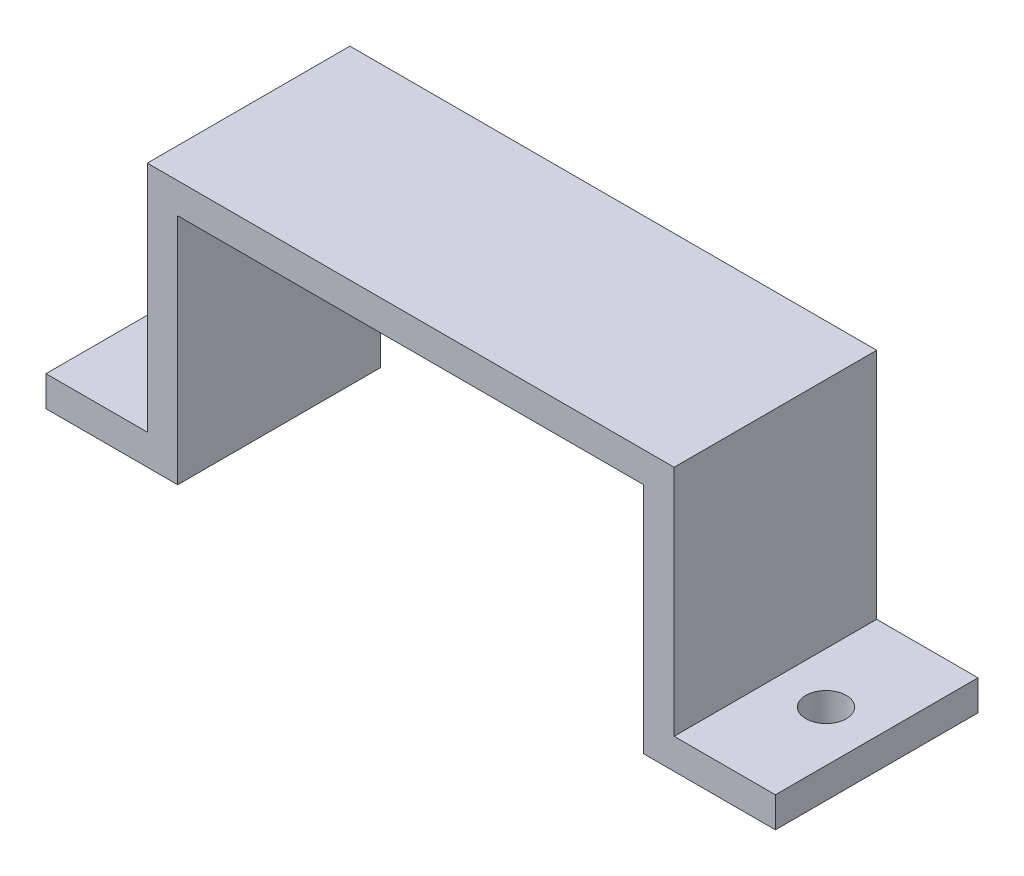
ISO-10303-21;
HEADER;
FILE_DESCRIPTION(('STEP AP214'),'2;1');
FILE_NAME('part.step','',(''),(''),'','','');
FILE_SCHEMA(('AUTOMOTIVE_DESIGN { 1 0 10303 214 1 1 1 1 }'));
ENDSEC;
DATA;
#1=APPLICATION_CONTEXT('core data for automotive mechanical design processes');
#2=APPLICATION_PROTOCOL_DEFINITION('international standard','automotive_design',2000,#1);
#3=PRODUCT_CONTEXT('',#1,'mechanical');
#4=PRODUCT('Part','Part','',(#3));
#5=PRODUCT_RELATED_PRODUCT_CATEGORY('part','',(#4));
#6=PRODUCT_DEFINITION_FORMATION('','',#4);
#7=PRODUCT_DEFINITION_CONTEXT('part definition',#1,'design');
#8=PRODUCT_DEFINITION('design','',#6,#7);
#9=PRODUCT_DEFINITION_SHAPE('','',#8);
#10=(LENGTH_UNIT() NAMED_UNIT(*) SI_UNIT(.MILLI.,.METRE.));
#11=(NAMED_UNIT(*) PLANE_ANGLE_UNIT() SI_UNIT($,.RADIAN.));
#12=(NAMED_UNIT(*) SI_UNIT($,.STERADIAN.) SOLID_ANGLE_UNIT());
#13=UNCERTAINTY_MEASURE_WITH_UNIT(LENGTH_MEASURE(1.E-05),#10,'distance_accuracy_value','');
#14=(GEOMETRIC_REPRESENTATION_CONTEXT(3) GLOBAL_UNCERTAINTY_ASSIGNED_CONTEXT((#13)) GLOBAL_UNIT_ASSIGNED_CONTEXT((#10,
#11,#12)) REPRESENTATION_CONTEXT('',''));
#15=CARTESIAN_POINT('',(0.,0.,0.));
#16=DIRECTION('',(0.,0.,1.));
#17=DIRECTION('',(1.,0.,0.));
#18=AXIS2_PLACEMENT_3D('',#15,#16,#17);
#19=CARTESIAN_POINT('',(-11.5,0.,10.));
#20=DIRECTION('',(-1.,0.,0.));
#21=DIRECTION('',(0.,-1.,0.));
#22=AXIS2_PLACEMENT_3D('',#19,#20,#21);
#23=PLANE('',#22);
#24=DIRECTION('',(0.,1.,0.));
#25=VECTOR('',#24,1.);
#26=CARTESIAN_POINT('',(-11.5,0.,0.));
#27=LINE('',#26,#25);
#28=CARTESIAN_POINT('',(-11.5,-1.5,0.));
#29=VERTEX_POINT('',#28);
#30=CARTESIAN_POINT('',(-11.5,10.,0.));
#31=VERTEX_POINT('',#30);
#32=EDGE_CURVE('E98',#29,#31,#27,.T.);
#33=ORIENTED_EDGE('',*,*,#32,.T.);
#34=DIRECTION('',(0.,0.,-1.));
#35=VECTOR('',#34,1.);
#36=CARTESIAN_POINT('',(-11.5,10.,10.));
#37=LINE('',#36,#35);
#38=CARTESIAN_POINT('',(-11.5,10.,10.));
#39=VERTEX_POINT('',#38);
#40=EDGE_CURVE('E11',#39,#31,#37,.T.);
#41=ORIENTED_EDGE('',*,*,#40,.F.);
#42=DIRECTION('',(0.,1.,0.));
#43=VECTOR('',#42,1.);
#44=CARTESIAN_POINT('',(-11.5,-1.5,10.));
#45=LINE('',#44,#43);
#46=CARTESIAN_POINT('',(-11.5,-1.5,10.));
#47=VERTEX_POINT('',#46);
#48=EDGE_CURVE('E104',#47,#39,#45,.T.);
#49=ORIENTED_EDGE('',*,*,#48,.F.);
#50=DIRECTION('',(0.,0.,-1.));
#51=VECTOR('',#50,1.);
#52=CARTESIAN_POINT('',(-11.5,-1.5,10.));
#53=LINE('',#52,#51);
#54=EDGE_CURVE('E150',#47,#29,#53,.T.);
#55=ORIENTED_EDGE('',*,*,#54,.T.);
#56=EDGE_LOOP('',(#33,#41,#49,#55));
#57=FACE_BOUND('',#56,.T.);
#58=ADVANCED_FACE('F33',(#57),#23,.F.);
#59=CARTESIAN_POINT('',(-11.5,10.,10.));
#60=DIRECTION('',(0.,1.,0.));
#61=DIRECTION('',(-1.,0.,0.));
#62=AXIS2_PLACEMENT_3D('',#59,#60,#61);
#63=PLANE('',#62);
#64=DIRECTION('',(1.,0.,0.));
#65=VECTOR('',#64,1.);
#66=CARTESIAN_POINT('',(-11.5,10.,0.));
#67=LINE('',#66,#65);
#68=CARTESIAN_POINT('',(11.5,10.,0.));
#69=VERTEX_POINT('',#68);
#70=EDGE_CURVE('E155',#31,#69,#67,.T.);
#71=ORIENTED_EDGE('',*,*,#70,.T.);
#72=DIRECTION('',(0.,0.,-1.));
#73=VECTOR('',#72,1.);
#74=CARTESIAN_POINT('',(11.5,10.,10.));
#75=LINE('',#74,#73);
#76=CARTESIAN_POINT('',(11.5,10.,10.));
#77=VERTEX_POINT('',#76);
#78=EDGE_CURVE('E42',#77,#69,#75,.T.);
#79=ORIENTED_EDGE('',*,*,#78,.F.);
#80=DIRECTION('',(1.,0.,0.));
#81=VECTOR('',#80,1.);
#82=CARTESIAN_POINT('',(-11.5,10.,10.));
#83=LINE('',#82,#81);
#84=EDGE_CURVE('E208',#39,#77,#83,.T.);
#85=ORIENTED_EDGE('',*,*,#84,.F.);
#86=ORIENTED_EDGE('',*,*,#40,.T.);
#87=EDGE_LOOP('',(#71,#79,#85,#86));
#88=FACE_BOUND('',#87,.T.);
#89=ADVANCED_FACE('F207',(#88),#63,.F.);
#90=CARTESIAN_POINT('',(11.5,-1.5,10.));
#91=DIRECTION('',(1.,0.,0.));
#92=DIRECTION('',(0.,1.,0.));
#93=AXIS2_PLACEMENT_3D('',#90,#91,#92);
#94=PLANE('',#93);
#95=DIRECTION('',(0.,-1.,0.));
#96=VECTOR('',#95,1.);
#97=CARTESIAN_POINT('',(11.5,-1.5,0.));
#98=LINE('',#97,#96);
#99=CARTESIAN_POINT('',(11.5,-1.5,0.));
#100=VERTEX_POINT('',#99);
#101=EDGE_CURVE('E158',#69,#100,#98,.T.);
#102=ORIENTED_EDGE('',*,*,#101,.T.);
#103=DIRECTION('',(0.,0.,-1.));
#104=VECTOR('',#103,1.);
#105=CARTESIAN_POINT('',(11.5,-1.5,10.));
#106=LINE('',#105,#104);
#107=CARTESIAN_POINT('',(11.5,-1.5,10.));
#108=VERTEX_POINT('',#107);
#109=EDGE_CURVE('E195',#108,#100,#106,.T.);
#110=ORIENTED_EDGE('',*,*,#109,.F.);
#111=DIRECTION('',(0.,-1.,0.));
#112=VECTOR('',#111,1.);
#113=CARTESIAN_POINT('',(11.5,10.,10.));
#114=LINE('',#113,#112);
#115=EDGE_CURVE('E204',#77,#108,#114,.T.);
#116=ORIENTED_EDGE('',*,*,#115,.F.);
#117=ORIENTED_EDGE('',*,*,#78,.T.);
#118=EDGE_LOOP('',(#102,#110,#116,#117));
#119=FACE_BOUND('',#118,.T.);
#120=ADVANCED_FACE('F202',(#119),#94,.F.);
#121=CARTESIAN_POINT('',(18.,-1.5,10.));
#122=DIRECTION('',(0.,1.,0.));
#123=DIRECTION('',(0.,0.,1.));
#124=AXIS2_PLACEMENT_3D('',#121,#122,#123);
#125=PLANE('',#124);
#126=CARTESIAN_POINT('',(15.5,-1.5,4.99999999999999));
#127=DIRECTION('',(0.,1.,0.));
#128=DIRECTION('',(1.,0.,0.));
#129=AXIS2_PLACEMENT_3D('',#126,#127,#128);
#130=CIRCLE('',#129,1.);
#131=CARTESIAN_POINT('',(16.5,-1.5,4.99999999999999));
#132=VERTEX_POINT('',#131);
#133=EDGE_CURVE('E253',#132,#132,#130,.T.);
#134=ORIENTED_EDGE('',*,*,#133,.T.);
#135=EDGE_LOOP('',(#134));
#136=FACE_BOUND('',#135,.T.);
#137=DIRECTION('',(1.,0.,0.));
#138=VECTOR('',#137,1.);
#139=CARTESIAN_POINT('',(18.,-1.5,0.));
#140=LINE('',#139,#138);
#141=CARTESIAN_POINT('',(18.,-1.5,0.));
#142=VERTEX_POINT('',#141);
#143=EDGE_CURVE('E160',#100,#142,#140,.T.);
#144=ORIENTED_EDGE('',*,*,#143,.T.);
#145=DIRECTION('',(0.,0.,-1.));
#146=VECTOR('',#145,1.);
#147=CARTESIAN_POINT('',(18.,-1.5,10.));
#148=LINE('',#147,#146);
#149=CARTESIAN_POINT('',(18.,-1.5,10.));
#150=VERTEX_POINT('',#149);
#151=EDGE_CURVE('E192',#150,#142,#148,.T.);
#152=ORIENTED_EDGE('',*,*,#151,.F.);
#153=DIRECTION('',(1.,0.,0.));
#154=VECTOR('',#153,1.);
#155=CARTESIAN_POINT('',(18.,-1.5,10.));
#156=LINE('',#155,#154);
#157=EDGE_CURVE('E224',#108,#150,#156,.T.);
#158=ORIENTED_EDGE('',*,*,#157,.F.);
#159=ORIENTED_EDGE('',*,*,#109,.T.);
#160=EDGE_LOOP('',(#144,#152,#158,#159));
#161=FACE_BOUND('',#160,.T.);
#162=ADVANCED_FACE('F215',(#136,#161),#125,.F.);
#163=CARTESIAN_POINT('',(18.,0.,10.));
#164=DIRECTION('',(-1.,0.,0.));
#165=DIRECTION('',(0.,0.,1.));
#166=AXIS2_PLACEMENT_3D('',#163,#164,#165);
#167=PLANE('',#166);
#168=DIRECTION('',(0.,1.,0.));
#169=VECTOR('',#168,1.);
#170=CARTESIAN_POINT('',(18.,0.,0.));
#171=LINE('',#170,#169);
#172=CARTESIAN_POINT('',(18.,0.,0.));
#173=VERTEX_POINT('',#172);
#174=EDGE_CURVE('E162',#142,#173,#171,.T.);
#175=ORIENTED_EDGE('',*,*,#174,.T.);
#176=DIRECTION('',(0.,0.,-1.));
#177=VECTOR('',#176,1.);
#178=CARTESIAN_POINT('',(18.,0.,10.));
#179=LINE('',#178,#177);
#180=CARTESIAN_POINT('',(18.,0.,10.));
#181=VERTEX_POINT('',#180);
#182=EDGE_CURVE('E189',#181,#173,#179,.T.);
#183=ORIENTED_EDGE('',*,*,#182,.F.);
#184=DIRECTION('',(0.,1.,0.));
#185=VECTOR('',#184,1.);
#186=CARTESIAN_POINT('',(18.,0.,10.));
#187=LINE('',#186,#185);
#188=EDGE_CURVE('E221',#150,#181,#187,.T.);
#189=ORIENTED_EDGE('',*,*,#188,.F.);
#190=ORIENTED_EDGE('',*,*,#151,.T.);
#191=EDGE_LOOP('',(#175,#183,#189,#190));
#192=FACE_BOUND('',#191,.T.);
#193=ADVANCED_FACE('F219',(#192),#167,.F.);
#194=CARTESIAN_POINT('',(13.,0.,10.));
#195=DIRECTION('',(0.,-1.,0.));
#196=DIRECTION('',(1.,0.,0.));
#197=AXIS2_PLACEMENT_3D('',#194,#195,#196);
#198=PLANE('',#197);
#199=CARTESIAN_POINT('',(15.5,0.,4.99999999999999));
#200=DIRECTION('',(0.,-1.,0.));
#201=DIRECTION('',(1.,0.,0.));
#202=AXIS2_PLACEMENT_3D('',#199,#200,#201);
#203=CIRCLE('',#202,1.);
#204=CARTESIAN_POINT('',(16.5,0.,4.99999999999999));
#205=VERTEX_POINT('',#204);
#206=EDGE_CURVE('E36',#205,#205,#203,.T.);
#207=ORIENTED_EDGE('',*,*,#206,.T.);
#208=EDGE_LOOP('',(#207));
#209=FACE_BOUND('',#208,.T.);
#210=DIRECTION('',(-1.,0.,0.));
#211=VECTOR('',#210,1.);
#212=CARTESIAN_POINT('',(13.,0.,0.));
#213=LINE('',#212,#211);
#214=CARTESIAN_POINT('',(13.,0.,0.));
#215=VERTEX_POINT('',#214);
#216=EDGE_CURVE('E164',#173,#215,#213,.T.);
#217=ORIENTED_EDGE('',*,*,#216,.T.);
#218=DIRECTION('',(0.,0.,-1.));
#219=VECTOR('',#218,1.);
#220=CARTESIAN_POINT('',(13.,0.,10.));
#221=LINE('',#220,#219);
#222=CARTESIAN_POINT('',(13.,0.,10.));
#223=VERTEX_POINT('',#222);
#224=EDGE_CURVE('E186',#223,#215,#221,.T.);
#225=ORIENTED_EDGE('',*,*,#224,.F.);
#226=DIRECTION('',(-1.,0.,0.));
#227=VECTOR('',#226,1.);
#228=CARTESIAN_POINT('',(13.,0.,10.));
#229=LINE('',#228,#227);
#230=EDGE_CURVE('E223',#181,#223,#229,.T.);
#231=ORIENTED_EDGE('',*,*,#230,.F.);
#232=ORIENTED_EDGE('',*,*,#182,.T.);
#233=EDGE_LOOP('',(#217,#225,#231,#232));
#234=FACE_BOUND('',#233,.T.);
#235=ADVANCED_FACE('F289',(#209,#234),#198,.F.);
#236=CARTESIAN_POINT('',(13.,11.5,10.));
#237=DIRECTION('',(-1.,0.,0.));
#238=DIRECTION('',(0.,-1.,0.));
#239=AXIS2_PLACEMENT_3D('',#236,#237,#238);
#240=PLANE('',#239);
#241=DIRECTION('',(0.,1.,0.));
#242=VECTOR('',#241,1.);
#243=CARTESIAN_POINT('',(13.,11.5,0.));
#244=LINE('',#243,#242);
#245=CARTESIAN_POINT('',(13.,11.5,0.));
#246=VERTEX_POINT('',#245);
#247=EDGE_CURVE('E166',#215,#246,#244,.T.);
#248=ORIENTED_EDGE('',*,*,#247,.T.);
#249=DIRECTION('',(0.,0.,-1.));
#250=VECTOR('',#249,1.);
#251=CARTESIAN_POINT('',(13.,11.5,10.));
#252=LINE('',#251,#250);
#253=CARTESIAN_POINT('',(13.,11.5,10.));
#254=VERTEX_POINT('',#253);
#255=EDGE_CURVE('E183',#254,#246,#252,.T.);
#256=ORIENTED_EDGE('',*,*,#255,.F.);
#257=DIRECTION('',(0.,1.,0.));
#258=VECTOR('',#257,1.);
#259=CARTESIAN_POINT('',(13.,11.5,10.));
#260=LINE('',#259,#258);
#261=EDGE_CURVE('E226',#223,#254,#260,.T.);
#262=ORIENTED_EDGE('',*,*,#261,.F.);
#263=ORIENTED_EDGE('',*,*,#224,.T.);
#264=EDGE_LOOP('',(#248,#256,#262,#263));
#265=FACE_BOUND('',#264,.T.);
#266=ADVANCED_FACE('F292',(#265),#240,.F.);
#267=CARTESIAN_POINT('',(-13.,11.5,10.));
#268=DIRECTION('',(0.,-1.,0.));
#269=DIRECTION('',(0.,0.,-1.));
#270=AXIS2_PLACEMENT_3D('',#267,#268,#269);
#271=PLANE('',#270);
#272=DIRECTION('',(-1.,0.,0.));
#273=VECTOR('',#272,1.);
#274=CARTESIAN_POINT('',(-13.,11.5,0.));
#275=LINE('',#274,#273);
#276=CARTESIAN_POINT('',(-13.,11.5,0.));
#277=VERTEX_POINT('',#276);
#278=EDGE_CURVE('E168',#246,#277,#275,.T.);
#279=ORIENTED_EDGE('',*,*,#278,.T.);
#280=DIRECTION('',(0.,0.,-1.));
#281=VECTOR('',#280,1.);
#282=CARTESIAN_POINT('',(-13.,11.5,10.));
#283=LINE('',#282,#281);
#284=CARTESIAN_POINT('',(-13.,11.5,10.));
#285=VERTEX_POINT('',#284);
#286=EDGE_CURVE('E180',#285,#277,#283,.T.);
#287=ORIENTED_EDGE('',*,*,#286,.F.);
#288=DIRECTION('',(-1.,0.,0.));
#289=VECTOR('',#288,1.);
#290=CARTESIAN_POINT('',(-13.,11.5,10.));
#291=LINE('',#290,#289);
#292=EDGE_CURVE('E232',#254,#285,#291,.T.);
#293=ORIENTED_EDGE('',*,*,#292,.F.);
#294=ORIENTED_EDGE('',*,*,#255,.T.);
#295=EDGE_LOOP('',(#279,#287,#293,#294));
#296=FACE_BOUND('',#295,.T.);
#297=ADVANCED_FACE('F238',(#296),#271,.F.);
#298=CARTESIAN_POINT('',(-13.,0.,10.));
#299=DIRECTION('',(1.,0.,0.));
#300=DIRECTION('',(0.,1.,0.));
#301=AXIS2_PLACEMENT_3D('',#298,#299,#300);
#302=PLANE('',#301);
#303=DIRECTION('',(0.,-1.,0.));
#304=VECTOR('',#303,1.);
#305=CARTESIAN_POINT('',(-13.,0.,0.));
#306=LINE('',#305,#304);
#307=CARTESIAN_POINT('',(-13.,0.,0.));
#308=VERTEX_POINT('',#307);
#309=EDGE_CURVE('E170',#277,#308,#306,.T.);
#310=ORIENTED_EDGE('',*,*,#309,.T.);
#311=DIRECTION('',(0.,0.,-1.));
#312=VECTOR('',#311,1.);
#313=CARTESIAN_POINT('',(-13.,0.,10.));
#314=LINE('',#313,#312);
#315=CARTESIAN_POINT('',(-13.,0.,10.));
#316=VERTEX_POINT('',#315);
#317=EDGE_CURVE('E145',#316,#308,#314,.T.);
#318=ORIENTED_EDGE('',*,*,#317,.F.);
#319=DIRECTION('',(0.,-1.,0.));
#320=VECTOR('',#319,1.);
#321=CARTESIAN_POINT('',(-13.,0.,10.));
#322=LINE('',#321,#320);
#323=EDGE_CURVE('E136',#285,#316,#322,.T.);
#324=ORIENTED_EDGE('',*,*,#323,.F.);
#325=ORIENTED_EDGE('',*,*,#286,.T.);
#326=EDGE_LOOP('',(#310,#318,#324,#325));
#327=FACE_BOUND('',#326,.T.);
#328=ADVANCED_FACE('F242',(#327),#302,.F.);
#329=CARTESIAN_POINT('',(-13.,0.,10.));
#330=DIRECTION('',(0.,-1.,0.));
#331=DIRECTION('',(1.,0.,0.));
#332=AXIS2_PLACEMENT_3D('',#329,#330,#331);
#333=PLANE('',#332);
#334=CARTESIAN_POINT('',(-15.5,0.,5.));
#335=DIRECTION('',(0.,-1.,0.));
#336=DIRECTION('',(1.,0.,0.));
#337=AXIS2_PLACEMENT_3D('',#334,#335,#336);
#338=CIRCLE('',#337,1.);
#339=CARTESIAN_POINT('',(-14.5,0.,5.));
#340=VERTEX_POINT('',#339);
#341=EDGE_CURVE('E249',#340,#340,#338,.T.);
#342=ORIENTED_EDGE('',*,*,#341,.T.);
#343=EDGE_LOOP('',(#342));
#344=FACE_BOUND('',#343,.T.);
#345=DIRECTION('',(-1.,0.,0.));
#346=VECTOR('',#345,1.);
#347=CARTESIAN_POINT('',(-13.,0.,0.));
#348=LINE('',#347,#346);
#349=CARTESIAN_POINT('',(-18.,0.,0.));
#350=VERTEX_POINT('',#349);
#351=EDGE_CURVE('E144',#308,#350,#348,.T.);
#352=ORIENTED_EDGE('',*,*,#351,.T.);
#353=DIRECTION('',(0.,0.,-1.));
#354=VECTOR('',#353,1.);
#355=CARTESIAN_POINT('',(-18.,0.,10.));
#356=LINE('',#355,#354);
#357=CARTESIAN_POINT('',(-18.,0.,10.));
#358=VERTEX_POINT('',#357);
#359=EDGE_CURVE('E141',#358,#350,#356,.T.);
#360=ORIENTED_EDGE('',*,*,#359,.F.);
#361=DIRECTION('',(-1.,0.,0.));
#362=VECTOR('',#361,1.);
#363=CARTESIAN_POINT('',(-13.,0.,10.));
#364=LINE('',#363,#362);
#365=EDGE_CURVE('E130',#316,#358,#364,.T.);
#366=ORIENTED_EDGE('',*,*,#365,.F.);
#367=ORIENTED_EDGE('',*,*,#317,.T.);
#368=EDGE_LOOP('',(#352,#360,#366,#367));
#369=FACE_BOUND('',#368,.T.);
#370=ADVANCED_FACE('F142',(#344,#369),#333,.F.);
#371=CARTESIAN_POINT('',(-18.,0.,10.));
#372=DIRECTION('',(1.,0.,0.));
#373=DIRECTION('',(0.,0.,-1.));
#374=AXIS2_PLACEMENT_3D('',#371,#372,#373);
#375=PLANE('',#374);
#376=DIRECTION('',(0.,-1.,0.));
#377=VECTOR('',#376,1.);
#378=CARTESIAN_POINT('',(-18.,0.,0.));
#379=LINE('',#378,#377);
#380=CARTESIAN_POINT('',(-18.,-1.5,0.));
#381=VERTEX_POINT('',#380);
#382=EDGE_CURVE('E91',#350,#381,#379,.T.);
#383=ORIENTED_EDGE('',*,*,#382,.T.);
#384=DIRECTION('',(0.,0.,-1.));
#385=VECTOR('',#384,1.);
#386=CARTESIAN_POINT('',(-18.,-1.5,10.));
#387=LINE('',#386,#385);
#388=CARTESIAN_POINT('',(-18.,-1.5,10.));
#389=VERTEX_POINT('',#388);
#390=EDGE_CURVE('E146',#389,#381,#387,.T.);
#391=ORIENTED_EDGE('',*,*,#390,.F.);
#392=DIRECTION('',(0.,-1.,0.));
#393=VECTOR('',#392,1.);
#394=CARTESIAN_POINT('',(-18.,0.,10.));
#395=LINE('',#394,#393);
#396=EDGE_CURVE('E134',#358,#389,#395,.T.);
#397=ORIENTED_EDGE('',*,*,#396,.F.);
#398=ORIENTED_EDGE('',*,*,#359,.T.);
#399=EDGE_LOOP('',(#383,#391,#397,#398));
#400=FACE_BOUND('',#399,.T.);
#401=ADVANCED_FACE('F148',(#400),#375,.F.);
#402=CARTESIAN_POINT('',(-18.,-1.5,10.));
#403=DIRECTION('',(0.,1.,0.));
#404=DIRECTION('',(0.,0.,1.));
#405=AXIS2_PLACEMENT_3D('',#402,#403,#404);
#406=PLANE('',#405);
#407=CARTESIAN_POINT('',(-15.5,-1.50000000000001,5.));
#408=DIRECTION('',(0.,1.,0.));
#409=DIRECTION('',(-1.,0.,0.));
#410=AXIS2_PLACEMENT_3D('',#407,#408,#409);
#411=CIRCLE('',#410,1.);
#412=CARTESIAN_POINT('',(-16.5,-1.50000000000001,5.));
#413=VERTEX_POINT('',#412);
#414=EDGE_CURVE('E252',#413,#413,#411,.T.);
#415=ORIENTED_EDGE('',*,*,#414,.T.);
#416=EDGE_LOOP('',(#415));
#417=FACE_BOUND('',#416,.T.);
#418=DIRECTION('',(1.,0.,0.));
#419=VECTOR('',#418,1.);
#420=CARTESIAN_POINT('',(-18.,-1.5,0.));
#421=LINE('',#420,#419);
#422=EDGE_CURVE('E174',#381,#29,#421,.T.);
#423=ORIENTED_EDGE('',*,*,#422,.T.);
#424=ORIENTED_EDGE('',*,*,#54,.F.);
#425=DIRECTION('',(1.,0.,0.));
#426=VECTOR('',#425,1.);
#427=CARTESIAN_POINT('',(-18.,-1.5,10.));
#428=LINE('',#427,#426);
#429=EDGE_CURVE('E50',#389,#47,#428,.T.);
#430=ORIENTED_EDGE('',*,*,#429,.F.);
#431=ORIENTED_EDGE('',*,*,#390,.T.);
#432=EDGE_LOOP('',(#423,#424,#430,#431));
#433=FACE_BOUND('',#432,.T.);
#434=ADVANCED_FACE('F244',(#417,#433),#406,.F.);
#435=CARTESIAN_POINT('',(0.,0.,10.));
#436=DIRECTION('',(0.,0.,-1.));
#437=DIRECTION('',(-1.,0.,0.));
#438=AXIS2_PLACEMENT_3D('',#435,#436,#437);
#439=PLANE('',#438);
#440=ORIENTED_EDGE('',*,*,#48,.T.);
#441=ORIENTED_EDGE('',*,*,#84,.T.);
#442=ORIENTED_EDGE('',*,*,#115,.T.);
#443=ORIENTED_EDGE('',*,*,#157,.T.);
#444=ORIENTED_EDGE('',*,*,#188,.T.);
#445=ORIENTED_EDGE('',*,*,#230,.T.);
#446=ORIENTED_EDGE('',*,*,#261,.T.);
#447=ORIENTED_EDGE('',*,*,#292,.T.);
#448=ORIENTED_EDGE('',*,*,#323,.T.);
#449=ORIENTED_EDGE('',*,*,#365,.T.);
#450=ORIENTED_EDGE('',*,*,#396,.T.);
#451=ORIENTED_EDGE('',*,*,#429,.T.);
#452=EDGE_LOOP('',(#440,#441,#442,#443,#444,#445,#446,#447,#448,#449,#450,#451));
#453=FACE_BOUND('',#452,.T.);
#454=ADVANCED_FACE('F132',(#453),#439,.F.);
#455=CARTESIAN_POINT('',(0.,0.,0.));
#456=DIRECTION('',(0.,0.,-1.));
#457=DIRECTION('',(-1.,0.,0.));
#458=AXIS2_PLACEMENT_3D('',#455,#456,#457);
#459=PLANE('',#458);
#460=ORIENTED_EDGE('',*,*,#32,.F.);
#461=ORIENTED_EDGE('',*,*,#422,.F.);
#462=ORIENTED_EDGE('',*,*,#382,.F.);
#463=ORIENTED_EDGE('',*,*,#351,.F.);
#464=ORIENTED_EDGE('',*,*,#309,.F.);
#465=ORIENTED_EDGE('',*,*,#278,.F.);
#466=ORIENTED_EDGE('',*,*,#247,.F.);
#467=ORIENTED_EDGE('',*,*,#216,.F.);
#468=ORIENTED_EDGE('',*,*,#174,.F.);
#469=ORIENTED_EDGE('',*,*,#143,.F.);
#470=ORIENTED_EDGE('',*,*,#101,.F.);
#471=ORIENTED_EDGE('',*,*,#70,.F.);
#472=EDGE_LOOP('',(#460,#461,#462,#463,#464,#465,#466,#467,#468,#469,#470,#471));
#473=FACE_BOUND('',#472,.T.);
#474=ADVANCED_FACE('F209',(#473),#459,.T.);
#475=CARTESIAN_POINT('',(-15.5,-1.50000000000001,5.));
#476=DIRECTION('',(0.,1.,0.));
#477=DIRECTION('',(-1.,0.,0.));
#478=AXIS2_PLACEMENT_3D('',#475,#476,#477);
#479=CYLINDRICAL_SURFACE('',#478,1.);
#480=ORIENTED_EDGE('',*,*,#414,.F.);
#481=EDGE_LOOP('',(#480));
#482=FACE_BOUND('',#481,.T.);
#483=ORIENTED_EDGE('',*,*,#341,.F.);
#484=EDGE_LOOP('',(#483));
#485=FACE_BOUND('',#484,.T.);
#486=ADVANCED_FACE('F260',(#482,#485),#479,.F.);
#487=CARTESIAN_POINT('',(15.5,-1.5,4.99999999999999));
#488=DIRECTION('',(0.,1.,0.));
#489=DIRECTION('',(-1.,0.,0.));
#490=AXIS2_PLACEMENT_3D('',#487,#488,#489);
#491=CYLINDRICAL_SURFACE('',#490,1.);
#492=ORIENTED_EDGE('',*,*,#133,.F.);
#493=EDGE_LOOP('',(#492));
#494=FACE_BOUND('',#493,.T.);
#495=ORIENTED_EDGE('',*,*,#206,.F.);
#496=EDGE_LOOP('',(#495));
#497=FACE_BOUND('',#496,.T.);
#498=ADVANCED_FACE('F263',(#494,#497),#491,.F.);
#499=CLOSED_SHELL('',(#58,#89,#120,#162,#193,#235,#266,#297,#328,#370,#401,#434,#454,#474,#486,#498));
#500=MANIFOLD_SOLID_BREP('B2',#499);
#501=ADVANCED_BREP_SHAPE_REPRESENTATION('',(#18,#500),#14);
#502=SHAPE_DEFINITION_REPRESENTATION(#9,#501);
ENDSEC;
END-ISO-10303-21;
